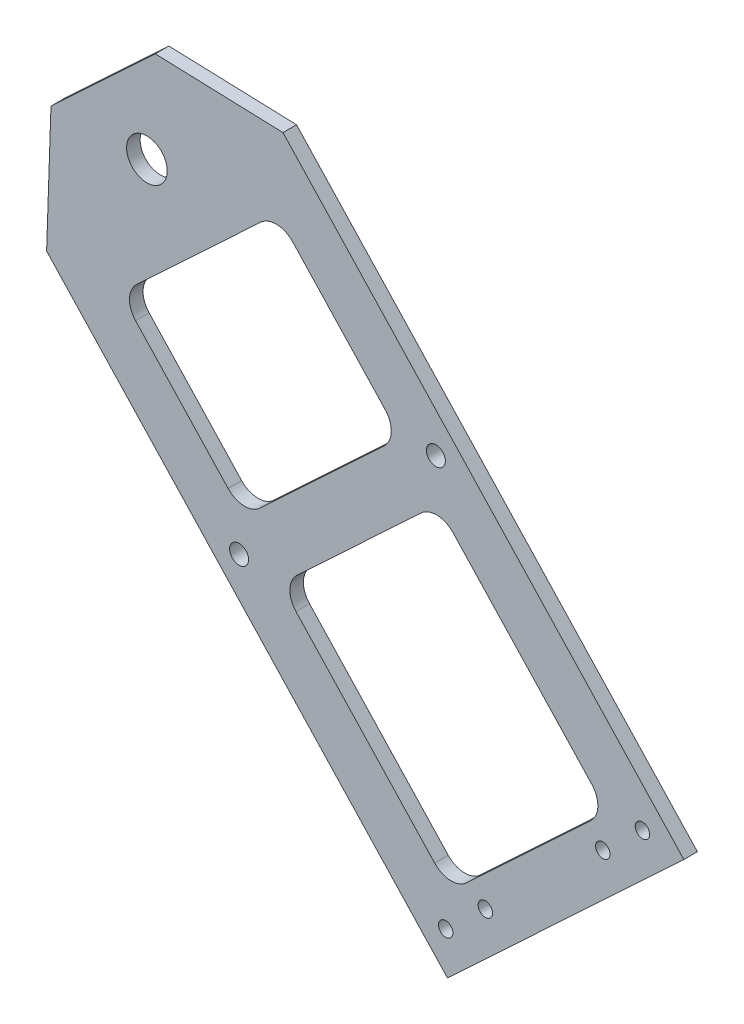
ISO-10303-21;
HEADER;
FILE_DESCRIPTION(('STEP AP214'),'2;1');
FILE_NAME('part.step','',(''),(''),'','','');
FILE_SCHEMA(('AUTOMOTIVE_DESIGN { 1 0 10303 214 1 1 1 1 }'));
ENDSEC;
DATA;
#1=APPLICATION_CONTEXT('core data for automotive mechanical design processes');
#2=APPLICATION_PROTOCOL_DEFINITION('international standard','automotive_design',2000,#1);
#3=PRODUCT_CONTEXT('',#1,'mechanical');
#4=PRODUCT('Part','Part','',(#3));
#5=PRODUCT_RELATED_PRODUCT_CATEGORY('part','',(#4));
#6=PRODUCT_DEFINITION_FORMATION('','',#4);
#7=PRODUCT_DEFINITION_CONTEXT('part definition',#1,'design');
#8=PRODUCT_DEFINITION('design','',#6,#7);
#9=PRODUCT_DEFINITION_SHAPE('','',#8);
#10=(LENGTH_UNIT() NAMED_UNIT(*) SI_UNIT(.MILLI.,.METRE.));
#11=(NAMED_UNIT(*) PLANE_ANGLE_UNIT() SI_UNIT($,.RADIAN.));
#12=(NAMED_UNIT(*) SI_UNIT($,.STERADIAN.) SOLID_ANGLE_UNIT());
#13=UNCERTAINTY_MEASURE_WITH_UNIT(LENGTH_MEASURE(1.E-05),#10,'distance_accuracy_value','');
#14=(GEOMETRIC_REPRESENTATION_CONTEXT(3) GLOBAL_UNCERTAINTY_ASSIGNED_CONTEXT((#13)) GLOBAL_UNIT_ASSIGNED_CONTEXT((#10,
#11,#12)) REPRESENTATION_CONTEXT('',''));
#15=CARTESIAN_POINT('',(0.,0.,0.));
#16=DIRECTION('',(0.,0.,1.));
#17=DIRECTION('',(1.,0.,0.));
#18=AXIS2_PLACEMENT_3D('',#15,#16,#17);
#19=CARTESIAN_POINT('',(0.,0.,3.));
#20=DIRECTION('',(0.,0.,1.));
#21=DIRECTION('',(1.,0.,0.));
#22=AXIS2_PLACEMENT_3D('',#19,#20,#21);
#23=PLANE('',#22);
#24=CARTESIAN_POINT('',(-290.234723661467,-122.373863649196,3.));
#25=DIRECTION('',(0.,0.,1.));
#26=DIRECTION('',(1.,0.,0.));
#27=AXIS2_PLACEMENT_3D('',#24,#25,#26);
#28=CIRCLE('',#27,1.59999999999996);
#29=CARTESIAN_POINT('',(-288.634723661467,-122.373863649196,3.));
#30=VERTEX_POINT('',#29);
#31=EDGE_CURVE('E509',#30,#30,#28,.T.);
#32=ORIENTED_EDGE('',*,*,#31,.F.);
#33=EDGE_LOOP('',(#32));
#34=FACE_BOUND('',#33,.T.);
#35=CARTESIAN_POINT('',(-325.019633878422,-154.866478520862,3.));
#36=DIRECTION('',(0.,0.,1.));
#37=DIRECTION('',(1.,0.,0.));
#38=AXIS2_PLACEMENT_3D('',#35,#36,#37);
#39=CIRCLE('',#38,1.59999999999996);
#40=CARTESIAN_POINT('',(-323.419633878422,-154.866478520862,3.));
#41=VERTEX_POINT('',#40);
#42=EDGE_CURVE('E521',#41,#41,#39,.T.);
#43=ORIENTED_EDGE('',*,*,#42,.F.);
#44=EDGE_LOOP('',(#43));
#45=FACE_BOUND('',#44,.T.);
#46=DIRECTION('',(-0.730775424725951,-0.682617959488765,0.));
#47=VECTOR('',#46,1.);
#48=CARTESIAN_POINT('',(-393.434315669179,-65.5108333971788,3.));
#49=LINE('',#48,#47);
#50=CARTESIAN_POINT('',(-365.957159699483,-39.8443981204011,3.));
#51=VERTEX_POINT('',#50);
#52=CARTESIAN_POINT('',(-393.434315669179,-65.5108333971787,3.));
#53=VERTEX_POINT('',#52);
#54=EDGE_CURVE('E192',#51,#53,#49,.T.);
#55=ORIENTED_EDGE('',*,*,#54,.F.);
#56=CARTESIAN_POINT('',(-362.544069902039,-43.4982752440309,3.));
#57=DIRECTION('',(0.,0.,1.));
#58=DIRECTION('',(1.,0.,0.));
#59=AXIS2_PLACEMENT_3D('',#56,#57,#58);
#60=CIRCLE('',#59,4.99999999999998);
#61=CARTESIAN_POINT('',(-358.890192778409,-40.085185446587,3.));
#62=VERTEX_POINT('',#61);
#63=EDGE_CURVE('E184',#62,#51,#60,.T.);
#64=ORIENTED_EDGE('',*,*,#63,.F.);
#65=DIRECTION('',(-0.682617959488765,0.730775424725951,0.));
#66=VECTOR('',#65,1.);
#67=CARTESIAN_POINT('',(-338.411653993746,-62.0084481883656,3.));
#68=LINE('',#67,#66);
#69=CARTESIAN_POINT('',(-338.411653993746,-62.0084481883656,3.));
#70=VERTEX_POINT('',#69);
#71=EDGE_CURVE('E219',#70,#62,#68,.T.);
#72=ORIENTED_EDGE('',*,*,#71,.F.);
#73=CARTESIAN_POINT('',(-342.065531117376,-65.4215379858094,3.));
#74=DIRECTION('',(0.,0.,1.));
#75=DIRECTION('',(1.,0.,0.));
#76=AXIS2_PLACEMENT_3D('',#73,#74,#75);
#77=CIRCLE('',#76,4.99999999999998);
#78=CARTESIAN_POINT('',(-338.652441319932,-69.0754151094392,3.));
#79=VERTEX_POINT('',#78);
#80=EDGE_CURVE('E217',#79,#70,#77,.T.);
#81=ORIENTED_EDGE('',*,*,#80,.F.);
#82=DIRECTION('',(0.730775424725951,0.682617959488766,0.));
#83=VECTOR('',#82,1.);
#84=CARTESIAN_POINT('',(-366.129597289628,-94.7418503862168,3.));
#85=LINE('',#84,#83);
#86=CARTESIAN_POINT('',(-366.129597289628,-94.7418503862168,3.));
#87=VERTEX_POINT('',#86);
#88=EDGE_CURVE('E215',#87,#79,#85,.T.);
#89=ORIENTED_EDGE('',*,*,#88,.F.);
#90=CARTESIAN_POINT('',(-369.542687087072,-91.0879732625871,3.));
#91=DIRECTION('',(0.,0.,1.));
#92=DIRECTION('',(1.,0.,0.));
#93=AXIS2_PLACEMENT_3D('',#90,#91,#92);
#94=CIRCLE('',#93,5.00000000000001);
#95=CARTESIAN_POINT('',(-373.196564210702,-94.5010630600309,3.));
#96=VERTEX_POINT('',#95);
#97=EDGE_CURVE('E213',#96,#87,#94,.T.);
#98=ORIENTED_EDGE('',*,*,#97,.F.);
#99=DIRECTION('',(0.682617959488766,-0.730775424725951,0.));
#100=VECTOR('',#99,1.);
#101=CARTESIAN_POINT('',(-373.196564210702,-94.5010630600309,3.));
#102=LINE('',#101,#100);
#103=CARTESIAN_POINT('',(-393.675102995365,-72.5778003182523,3.));
#104=VERTEX_POINT('',#103);
#105=EDGE_CURVE('E208',#104,#96,#102,.T.);
#106=ORIENTED_EDGE('',*,*,#105,.F.);
#107=CARTESIAN_POINT('',(-390.021225871735,-69.1647105208085,3.));
#108=DIRECTION('',(0.,0.,1.));
#109=DIRECTION('',(-1.,0.,0.));
#110=AXIS2_PLACEMENT_3D('',#107,#108,#109);
#111=CIRCLE('',#110,5.);
#112=EDGE_CURVE('E206',#53,#104,#111,.T.);
#113=ORIENTED_EDGE('',*,*,#112,.F.);
#114=EDGE_LOOP('',(#55,#64,#72,#81,#89,#98,#106,#113));
#115=FACE_BOUND('',#114,.T.);
#116=CARTESIAN_POINT('',(-370.75503716417,-105.904525064223,3.));
#117=DIRECTION('',(0.,0.,1.));
#118=DIRECTION('',(1.,0.,0.));
#119=AXIS2_PLACEMENT_3D('',#116,#117,#118);
#120=CIRCLE('',#119,2.10000000000005);
#121=CARTESIAN_POINT('',(-368.65503716417,-105.904525064223,3.));
#122=VERTEX_POINT('',#121);
#123=EDGE_CURVE('E252',#122,#122,#120,.T.);
#124=ORIENTED_EDGE('',*,*,#123,.F.);
#125=EDGE_LOOP('',(#124));
#126=FACE_BOUND('',#125,.T.);
#127=DIRECTION('',(-0.682617959488764,0.730775424725952,0.));
#128=VECTOR('',#127,1.);
#129=CARTESIAN_POINT('',(-292.676250707999,-110.970401645004,3.));
#130=LINE('',#129,#128);
#131=CARTESIAN_POINT('',(-292.676250707999,-110.970401645004,3.));
#132=VERTEX_POINT('',#131);
#133=CARTESIAN_POINT('',(-323.394058884994,-78.0855075323366,3.));
#134=VERTEX_POINT('',#133);
#135=EDGE_CURVE('E266',#132,#134,#130,.T.);
#136=ORIENTED_EDGE('',*,*,#135,.F.);
#137=CARTESIAN_POINT('',(-296.330127831629,-114.383491442448,3.));
#138=DIRECTION('',(0.,0.,1.));
#139=DIRECTION('',(1.,0.,0.));
#140=AXIS2_PLACEMENT_3D('',#137,#138,#139);
#141=CIRCLE('',#140,5.00000000000002);
#142=CARTESIAN_POINT('',(-292.917038034185,-118.037368566078,3.));
#143=VERTEX_POINT('',#142);
#144=EDGE_CURVE('E264',#143,#132,#141,.T.);
#145=ORIENTED_EDGE('',*,*,#144,.F.);
#146=DIRECTION('',(0.730775424725952,0.682617959488764,0.));
#147=VECTOR('',#146,1.);
#148=CARTESIAN_POINT('',(-320.394194003881,-143.703803842856,3.));
#149=LINE('',#148,#147);
#150=CARTESIAN_POINT('',(-320.394194003881,-143.703803842856,3.));
#151=VERTEX_POINT('',#150);
#152=EDGE_CURVE('E280',#151,#143,#149,.T.);
#153=ORIENTED_EDGE('',*,*,#152,.F.);
#154=CARTESIAN_POINT('',(-323.807283801325,-140.049926719226,3.));
#155=DIRECTION('',(0.,0.,1.));
#156=DIRECTION('',(1.,0.,0.));
#157=AXIS2_PLACEMENT_3D('',#154,#155,#156);
#158=CIRCLE('',#157,4.99999999999997);
#159=CARTESIAN_POINT('',(-327.461160924954,-143.46301651667,3.));
#160=VERTEX_POINT('',#159);
#161=EDGE_CURVE('E277',#160,#151,#158,.T.);
#162=ORIENTED_EDGE('',*,*,#161,.F.);
#163=DIRECTION('',(0.682617959488765,-0.730775424725951,0.));
#164=VECTOR('',#163,1.);
#165=CARTESIAN_POINT('',(-327.461160924954,-143.46301651667,3.));
#166=LINE('',#165,#164);
#167=CARTESIAN_POINT('',(-358.178969101949,-110.578122404002,3.));
#168=VERTEX_POINT('',#167);
#169=EDGE_CURVE('E275',#168,#160,#166,.T.);
#170=ORIENTED_EDGE('',*,*,#169,.F.);
#171=CARTESIAN_POINT('',(-354.525091978319,-107.165032606558,3.));
#172=DIRECTION('',(0.,0.,1.));
#173=DIRECTION('',(-1.,0.,0.));
#174=AXIS2_PLACEMENT_3D('',#171,#172,#173);
#175=CIRCLE('',#174,4.99999999999999);
#176=CARTESIAN_POINT('',(-357.938181775763,-103.511155482928,3.));
#177=VERTEX_POINT('',#176);
#178=EDGE_CURVE('E273',#177,#168,#175,.T.);
#179=ORIENTED_EDGE('',*,*,#178,.F.);
#180=DIRECTION('',(-0.730775424725951,-0.682617959488766,0.));
#181=VECTOR('',#180,1.);
#182=CARTESIAN_POINT('',(-357.938181775763,-103.511155482928,3.));
#183=LINE('',#182,#181);
#184=CARTESIAN_POINT('',(-330.461025806067,-77.8447202061507,3.));
#185=VERTEX_POINT('',#184);
#186=EDGE_CURVE('E271',#185,#177,#183,.T.);
#187=ORIENTED_EDGE('',*,*,#186,.F.);
#188=CARTESIAN_POINT('',(-327.047936008623,-81.4985973297804,3.));
#189=DIRECTION('',(0.,0.,1.));
#190=DIRECTION('',(1.,0.,0.));
#191=AXIS2_PLACEMENT_3D('',#188,#189,#190);
#192=CIRCLE('',#191,5.00000000000002);
#193=EDGE_CURVE('E269',#134,#185,#192,.T.);
#194=ORIENTED_EDGE('',*,*,#193,.F.);
#195=EDGE_LOOP('',(#136,#145,#153,#162,#170,#179,#187,#194));
#196=FACE_BOUND('',#195,.T.);
#197=DIRECTION('',(-0.0340524702339699,-0.999420046462429,0.));
#198=VECTOR('',#197,1.);
#199=CARTESIAN_POINT('',(-413.366295443896,-69.0768090365023,3.));
#200=LINE('',#199,#198);
#201=CARTESIAN_POINT('',(-412.403146139153,-40.808941352208,3.));
#202=VERTEX_POINT('',#201);
#203=CARTESIAN_POINT('',(-413.366295443896,-69.0768090365023,3.));
#204=VERTEX_POINT('',#203);
#205=EDGE_CURVE('E323',#202,#204,#200,.T.);
#206=ORIENTED_EDGE('',*,*,#205,.T.);
#207=DIRECTION('',(0.682617959488766,-0.730775424725951,0.));
#208=VECTOR('',#207,1.);
#209=CARTESIAN_POINT('',(-324.625960710357,-164.077614250876,3.));
#210=LINE('',#209,#208);
#211=CARTESIAN_POINT('',(-324.625960710357,-164.077614250876,3.));
#212=VERTEX_POINT('',#211);
#213=EDGE_CURVE('E326',#204,#212,#210,.T.);
#214=ORIENTED_EDGE('',*,*,#213,.T.);
#215=DIRECTION('',(0.730775424725951,0.682617959488765,0.));
#216=VECTOR('',#215,1.);
#217=CARTESIAN_POINT('',(-324.625960710357,-164.077614250876,3.));
#218=LINE('',#217,#216);
#219=CARTESIAN_POINT('',(-272.302440299979,-115.20216835148,3.));
#220=VERTEX_POINT('',#219);
#221=EDGE_CURVE('E329',#212,#220,#218,.T.);
#222=ORIENTED_EDGE('',*,*,#221,.T.);
#223=DIRECTION('',(-0.682617959488766,0.730775424725951,0.));
#224=VECTOR('',#223,1.);
#225=CARTESIAN_POINT('',(-272.302440299979,-115.20216835148,3.));
#226=LINE('',#225,#224);
#227=CARTESIAN_POINT('',(-361.042775033518,-20.2013631371067,3.));
#228=VERTEX_POINT('',#227);
#229=EDGE_CURVE('E331',#220,#228,#226,.T.);
#230=ORIENTED_EDGE('',*,*,#229,.T.);
#231=DIRECTION('',(-0.999420046462429,0.0340524702339712,0.));
#232=VECTOR('',#231,1.);
#233=CARTESIAN_POINT('',(-361.042775033518,-20.2013631371067,3.));
#234=LINE('',#233,#232);
#235=CARTESIAN_POINT('',(-389.310642717812,-19.2382138323629,3.));
#236=VERTEX_POINT('',#235);
#237=EDGE_CURVE('E333',#228,#236,#234,.T.);
#238=ORIENTED_EDGE('',*,*,#237,.T.);
#239=DIRECTION('',(-0.730775424725951,-0.682617959488765,0.));
#240=VECTOR('',#239,1.);
#241=CARTESIAN_POINT('',(-412.403146139153,-40.808941352208,3.));
#242=LINE('',#241,#240);
#243=EDGE_CURVE('E335',#236,#202,#242,.T.);
#244=ORIENTED_EDGE('',*,*,#243,.T.);
#245=EDGE_LOOP('',(#206,#214,#222,#230,#238,#244));
#246=FACE_BOUND('',#245,.T.);
#247=CARTESIAN_POINT('',(-327.200821850503,-65.2204946786926,3.));
#248=DIRECTION('',(0.,0.,1.));
#249=DIRECTION('',(1.,0.,0.));
#250=AXIS2_PLACEMENT_3D('',#247,#248,#249);
#251=CIRCLE('',#250,2.09999999999999);
#252=CARTESIAN_POINT('',(-325.100821850503,-65.2204946786926,3.));
#253=VERTEX_POINT('',#252);
#254=EDGE_CURVE('E258',#253,#253,#251,.T.);
#255=ORIENTED_EDGE('',*,*,#254,.F.);
#256=EDGE_LOOP('',(#255));
#257=FACE_BOUND('',#256,.T.);
#258=CARTESIAN_POINT('',(-391.163719403753,-40.4005886233782,3.));
#259=DIRECTION('',(0.,0.,1.));
#260=DIRECTION('',(1.,0.,0.));
#261=AXIS2_PLACEMENT_3D('',#258,#259,#260);
#262=CIRCLE('',#261,4.50000000000002);
#263=CARTESIAN_POINT('',(-386.663719403753,-40.4005886233782,3.));
#264=VERTEX_POINT('',#263);
#265=EDGE_CURVE('E222',#264,#264,#262,.T.);
#266=ORIENTED_EDGE('',*,*,#265,.F.);
#267=EDGE_LOOP('',(#266));
#268=FACE_BOUND('',#267,.T.);
#269=CARTESIAN_POINT('',(-316.250328781711,-146.675063006997,3.));
#270=DIRECTION('',(0.,0.,1.));
#271=DIRECTION('',(1.,0.,0.));
#272=AXIS2_PLACEMENT_3D('',#269,#270,#271);
#273=CIRCLE('',#272,1.59999999999996);
#274=CARTESIAN_POINT('',(-314.650328781711,-146.675063006997,3.));
#275=VERTEX_POINT('',#274);
#276=EDGE_CURVE('E515',#275,#275,#273,.T.);
#277=ORIENTED_EDGE('',*,*,#276,.F.);
#278=EDGE_LOOP('',(#277));
#279=FACE_BOUND('',#278,.T.);
#280=CARTESIAN_POINT('',(-281.465418564756,-114.182448135331,3.));
#281=DIRECTION('',(0.,0.,1.));
#282=DIRECTION('',(1.,0.,0.));
#283=AXIS2_PLACEMENT_3D('',#280,#281,#282);
#284=CIRCLE('',#283,1.59999999999996);
#285=CARTESIAN_POINT('',(-279.865418564756,-114.182448135331,3.));
#286=VERTEX_POINT('',#285);
#287=EDGE_CURVE('E500',#286,#286,#284,.T.);
#288=ORIENTED_EDGE('',*,*,#287,.F.);
#289=EDGE_LOOP('',(#288));
#290=FACE_BOUND('',#289,.T.);
#291=ADVANCED_FACE('F35',(#34,#45,#115,#126,#196,#246,#257,#268,#279,#290),#23,.T.);
#292=CARTESIAN_POINT('',(0.,0.,0.));
#293=DIRECTION('',(0.,0.,1.));
#294=DIRECTION('',(1.,0.,0.));
#295=AXIS2_PLACEMENT_3D('',#292,#293,#294);
#296=PLANE('',#295);
#297=CARTESIAN_POINT('',(-370.75503716417,-105.904525064223,0.));
#298=DIRECTION('',(0.,0.,1.));
#299=DIRECTION('',(1.,0.,0.));
#300=AXIS2_PLACEMENT_3D('',#297,#298,#299);
#301=CIRCLE('',#300,2.10000000000005);
#302=CARTESIAN_POINT('',(-368.65503716417,-105.904525064223,0.));
#303=VERTEX_POINT('',#302);
#304=EDGE_CURVE('E200',#303,#303,#301,.T.);
#305=ORIENTED_EDGE('',*,*,#304,.T.);
#306=EDGE_LOOP('',(#305));
#307=FACE_BOUND('',#306,.T.);
#308=CARTESIAN_POINT('',(-327.200821850503,-65.2204946786926,0.));
#309=DIRECTION('',(0.,0.,1.));
#310=DIRECTION('',(1.,0.,0.));
#311=AXIS2_PLACEMENT_3D('',#308,#309,#310);
#312=CIRCLE('',#311,2.09999999999999);
#313=CARTESIAN_POINT('',(-325.100821850503,-65.2204946786926,0.));
#314=VERTEX_POINT('',#313);
#315=EDGE_CURVE('E255',#314,#314,#312,.T.);
#316=ORIENTED_EDGE('',*,*,#315,.T.);
#317=EDGE_LOOP('',(#316));
#318=FACE_BOUND('',#317,.T.);
#319=CARTESIAN_POINT('',(-296.330127831629,-114.383491442448,0.));
#320=DIRECTION('',(0.,0.,1.));
#321=DIRECTION('',(1.,0.,0.));
#322=AXIS2_PLACEMENT_3D('',#319,#320,#321);
#323=CIRCLE('',#322,5.00000000000002);
#324=CARTESIAN_POINT('',(-292.917038034185,-118.037368566078,0.));
#325=VERTEX_POINT('',#324);
#326=CARTESIAN_POINT('',(-292.676250707999,-110.970401645004,0.));
#327=VERTEX_POINT('',#326);
#328=EDGE_CURVE('E261',#325,#327,#323,.T.);
#329=ORIENTED_EDGE('',*,*,#328,.T.);
#330=DIRECTION('',(-0.682617959488764,0.730775424725952,0.));
#331=VECTOR('',#330,1.);
#332=CARTESIAN_POINT('',(-292.676250707999,-110.970401645004,0.));
#333=LINE('',#332,#331);
#334=CARTESIAN_POINT('',(-323.394058884994,-78.0855075323366,0.));
#335=VERTEX_POINT('',#334);
#336=EDGE_CURVE('E285',#327,#335,#333,.T.);
#337=ORIENTED_EDGE('',*,*,#336,.T.);
#338=CARTESIAN_POINT('',(-327.047936008623,-81.4985973297804,0.));
#339=DIRECTION('',(0.,0.,1.));
#340=DIRECTION('',(1.,0.,0.));
#341=AXIS2_PLACEMENT_3D('',#338,#339,#340);
#342=CIRCLE('',#341,5.00000000000002);
#343=CARTESIAN_POINT('',(-330.461025806067,-77.8447202061507,0.));
#344=VERTEX_POINT('',#343);
#345=EDGE_CURVE('E288',#335,#344,#342,.T.);
#346=ORIENTED_EDGE('',*,*,#345,.T.);
#347=DIRECTION('',(-0.730775424725951,-0.682617959488766,0.));
#348=VECTOR('',#347,1.);
#349=CARTESIAN_POINT('',(-357.938181775763,-103.511155482928,0.));
#350=LINE('',#349,#348);
#351=CARTESIAN_POINT('',(-357.938181775763,-103.511155482928,0.));
#352=VERTEX_POINT('',#351);
#353=EDGE_CURVE('E291',#344,#352,#350,.T.);
#354=ORIENTED_EDGE('',*,*,#353,.T.);
#355=CARTESIAN_POINT('',(-354.525091978319,-107.165032606558,0.));
#356=DIRECTION('',(0.,0.,1.));
#357=DIRECTION('',(-1.,0.,0.));
#358=AXIS2_PLACEMENT_3D('',#355,#356,#357);
#359=CIRCLE('',#358,4.99999999999999);
#360=CARTESIAN_POINT('',(-358.178969101949,-110.578122404002,0.));
#361=VERTEX_POINT('',#360);
#362=EDGE_CURVE('E294',#352,#361,#359,.T.);
#363=ORIENTED_EDGE('',*,*,#362,.T.);
#364=DIRECTION('',(0.682617959488765,-0.730775424725951,0.));
#365=VECTOR('',#364,1.);
#366=CARTESIAN_POINT('',(-327.461160924954,-143.46301651667,0.));
#367=LINE('',#366,#365);
#368=CARTESIAN_POINT('',(-327.461160924954,-143.46301651667,0.));
#369=VERTEX_POINT('',#368);
#370=EDGE_CURVE('E297',#361,#369,#367,.T.);
#371=ORIENTED_EDGE('',*,*,#370,.T.);
#372=CARTESIAN_POINT('',(-323.807283801325,-140.049926719226,0.));
#373=DIRECTION('',(0.,0.,1.));
#374=DIRECTION('',(1.,0.,0.));
#375=AXIS2_PLACEMENT_3D('',#372,#373,#374);
#376=CIRCLE('',#375,4.99999999999997);
#377=CARTESIAN_POINT('',(-320.394194003881,-143.703803842856,0.));
#378=VERTEX_POINT('',#377);
#379=EDGE_CURVE('E300',#369,#378,#376,.T.);
#380=ORIENTED_EDGE('',*,*,#379,.T.);
#381=DIRECTION('',(0.730775424725952,0.682617959488764,0.));
#382=VECTOR('',#381,1.);
#383=CARTESIAN_POINT('',(-320.394194003881,-143.703803842856,0.));
#384=LINE('',#383,#382);
#385=EDGE_CURVE('E267',#378,#325,#384,.T.);
#386=ORIENTED_EDGE('',*,*,#385,.T.);
#387=EDGE_LOOP('',(#329,#337,#346,#354,#363,#371,#380,#386));
#388=FACE_BOUND('',#387,.T.);
#389=DIRECTION('',(-0.0340524702339699,-0.999420046462429,0.));
#390=VECTOR('',#389,1.);
#391=CARTESIAN_POINT('',(-413.366295443896,-69.0768090365023,0.));
#392=LINE('',#391,#390);
#393=CARTESIAN_POINT('',(-412.403146139153,-40.808941352208,0.));
#394=VERTEX_POINT('',#393);
#395=CARTESIAN_POINT('',(-413.366295443896,-69.0768090365023,0.));
#396=VERTEX_POINT('',#395);
#397=EDGE_CURVE('E322',#394,#396,#392,.T.);
#398=ORIENTED_EDGE('',*,*,#397,.F.);
#399=DIRECTION('',(-0.730775424725951,-0.682617959488765,0.));
#400=VECTOR('',#399,1.);
#401=CARTESIAN_POINT('',(-412.403146139153,-40.808941352208,0.));
#402=LINE('',#401,#400);
#403=CARTESIAN_POINT('',(-389.310642717812,-19.2382138323629,0.));
#404=VERTEX_POINT('',#403);
#405=EDGE_CURVE('E327',#404,#394,#402,.T.);
#406=ORIENTED_EDGE('',*,*,#405,.F.);
#407=DIRECTION('',(-0.999420046462429,0.0340524702339712,0.));
#408=VECTOR('',#407,1.);
#409=CARTESIAN_POINT('',(-361.042775033518,-20.2013631371067,0.));
#410=LINE('',#409,#408);
#411=CARTESIAN_POINT('',(-361.042775033518,-20.2013631371067,0.));
#412=VERTEX_POINT('',#411);
#413=EDGE_CURVE('E346',#412,#404,#410,.T.);
#414=ORIENTED_EDGE('',*,*,#413,.F.);
#415=DIRECTION('',(-0.682617959488766,0.730775424725951,0.));
#416=VECTOR('',#415,1.);
#417=CARTESIAN_POINT('',(-272.302440299979,-115.20216835148,0.));
#418=LINE('',#417,#416);
#419=CARTESIAN_POINT('',(-272.302440299979,-115.20216835148,0.));
#420=VERTEX_POINT('',#419);
#421=EDGE_CURVE('E344',#420,#412,#418,.T.);
#422=ORIENTED_EDGE('',*,*,#421,.F.);
#423=DIRECTION('',(0.730775424725951,0.682617959488765,0.));
#424=VECTOR('',#423,1.);
#425=CARTESIAN_POINT('',(-324.625960710357,-164.077614250876,0.));
#426=LINE('',#425,#424);
#427=CARTESIAN_POINT('',(-324.625960710357,-164.077614250876,0.));
#428=VERTEX_POINT('',#427);
#429=EDGE_CURVE('E342',#428,#420,#426,.T.);
#430=ORIENTED_EDGE('',*,*,#429,.F.);
#431=DIRECTION('',(0.682617959488766,-0.730775424725951,0.));
#432=VECTOR('',#431,1.);
#433=CARTESIAN_POINT('',(-324.625960710357,-164.077614250876,0.));
#434=LINE('',#433,#432);
#435=EDGE_CURVE('E340',#396,#428,#434,.T.);
#436=ORIENTED_EDGE('',*,*,#435,.F.);
#437=EDGE_LOOP('',(#398,#406,#414,#422,#430,#436));
#438=FACE_BOUND('',#437,.T.);
#439=CARTESIAN_POINT('',(-362.544069902039,-43.4982752440309,0.));
#440=DIRECTION('',(0.,0.,1.));
#441=DIRECTION('',(1.,0.,0.));
#442=AXIS2_PLACEMENT_3D('',#439,#440,#441);
#443=CIRCLE('',#442,4.99999999999998);
#444=CARTESIAN_POINT('',(-358.890192778409,-40.085185446587,0.));
#445=VERTEX_POINT('',#444);
#446=CARTESIAN_POINT('',(-365.957159699483,-39.8443981204011,0.));
#447=VERTEX_POINT('',#446);
#448=EDGE_CURVE('E58',#445,#447,#443,.T.);
#449=ORIENTED_EDGE('',*,*,#448,.T.);
#450=DIRECTION('',(-0.730775424725951,-0.682617959488765,0.));
#451=VECTOR('',#450,1.);
#452=CARTESIAN_POINT('',(-393.434315669179,-65.5108333971788,0.));
#453=LINE('',#452,#451);
#454=CARTESIAN_POINT('',(-393.434315669179,-65.5108333971787,0.));
#455=VERTEX_POINT('',#454);
#456=EDGE_CURVE('E199',#447,#455,#453,.T.);
#457=ORIENTED_EDGE('',*,*,#456,.T.);
#458=CARTESIAN_POINT('',(-390.021225871735,-69.1647105208085,0.));
#459=DIRECTION('',(0.,0.,1.));
#460=DIRECTION('',(-1.,0.,0.));
#461=AXIS2_PLACEMENT_3D('',#458,#459,#460);
#462=CIRCLE('',#461,5.);
#463=CARTESIAN_POINT('',(-393.675102995365,-72.5778003182523,0.));
#464=VERTEX_POINT('',#463);
#465=EDGE_CURVE('E224',#455,#464,#462,.T.);
#466=ORIENTED_EDGE('',*,*,#465,.T.);
#467=DIRECTION('',(0.682617959488766,-0.730775424725951,0.));
#468=VECTOR('',#467,1.);
#469=CARTESIAN_POINT('',(-373.196564210702,-94.5010630600309,0.));
#470=LINE('',#469,#468);
#471=CARTESIAN_POINT('',(-373.196564210702,-94.5010630600309,0.));
#472=VERTEX_POINT('',#471);
#473=EDGE_CURVE('E227',#464,#472,#470,.T.);
#474=ORIENTED_EDGE('',*,*,#473,.T.);
#475=CARTESIAN_POINT('',(-369.542687087072,-91.0879732625871,0.));
#476=DIRECTION('',(0.,0.,1.));
#477=DIRECTION('',(1.,0.,0.));
#478=AXIS2_PLACEMENT_3D('',#475,#476,#477);
#479=CIRCLE('',#478,5.00000000000001);
#480=CARTESIAN_POINT('',(-366.129597289628,-94.7418503862168,0.));
#481=VERTEX_POINT('',#480);
#482=EDGE_CURVE('E230',#472,#481,#479,.T.);
#483=ORIENTED_EDGE('',*,*,#482,.T.);
#484=DIRECTION('',(0.730775424725951,0.682617959488766,0.));
#485=VECTOR('',#484,1.);
#486=CARTESIAN_POINT('',(-366.129597289628,-94.7418503862168,0.));
#487=LINE('',#486,#485);
#488=CARTESIAN_POINT('',(-338.652441319932,-69.0754151094392,0.));
#489=VERTEX_POINT('',#488);
#490=EDGE_CURVE('E233',#481,#489,#487,.T.);
#491=ORIENTED_EDGE('',*,*,#490,.T.);
#492=CARTESIAN_POINT('',(-342.065531117376,-65.4215379858094,0.));
#493=DIRECTION('',(0.,0.,1.));
#494=DIRECTION('',(1.,0.,0.));
#495=AXIS2_PLACEMENT_3D('',#492,#493,#494);
#496=CIRCLE('',#495,4.99999999999998);
#497=CARTESIAN_POINT('',(-338.411653993746,-62.0084481883656,0.));
#498=VERTEX_POINT('',#497);
#499=EDGE_CURVE('E236',#489,#498,#496,.T.);
#500=ORIENTED_EDGE('',*,*,#499,.T.);
#501=DIRECTION('',(-0.682617959488765,0.730775424725951,0.));
#502=VECTOR('',#501,1.);
#503=CARTESIAN_POINT('',(-338.411653993746,-62.0084481883656,0.));
#504=LINE('',#503,#502);
#505=EDGE_CURVE('E193',#498,#445,#504,.T.);
#506=ORIENTED_EDGE('',*,*,#505,.T.);
#507=EDGE_LOOP('',(#449,#457,#466,#474,#483,#491,#500,#506));
#508=FACE_BOUND('',#507,.T.);
#509=CARTESIAN_POINT('',(-391.163719403753,-40.4005886233782,0.));
#510=DIRECTION('',(0.,0.,1.));
#511=DIRECTION('',(1.,0.,0.));
#512=AXIS2_PLACEMENT_3D('',#509,#510,#511);
#513=CIRCLE('',#512,4.50000000000002);
#514=CARTESIAN_POINT('',(-386.663719403753,-40.4005886233782,0.));
#515=VERTEX_POINT('',#514);
#516=EDGE_CURVE('E524',#515,#515,#513,.T.);
#517=ORIENTED_EDGE('',*,*,#516,.T.);
#518=EDGE_LOOP('',(#517));
#519=FACE_BOUND('',#518,.T.);
#520=CARTESIAN_POINT('',(-325.019633878422,-154.866478520862,0.));
#521=DIRECTION('',(0.,0.,1.));
#522=DIRECTION('',(1.,0.,0.));
#523=AXIS2_PLACEMENT_3D('',#520,#521,#522);
#524=CIRCLE('',#523,1.59999999999996);
#525=CARTESIAN_POINT('',(-323.419633878422,-154.866478520862,0.));
#526=VERTEX_POINT('',#525);
#527=EDGE_CURVE('E518',#526,#526,#524,.T.);
#528=ORIENTED_EDGE('',*,*,#527,.T.);
#529=EDGE_LOOP('',(#528));
#530=FACE_BOUND('',#529,.T.);
#531=CARTESIAN_POINT('',(-316.250328781711,-146.675063006997,0.));
#532=DIRECTION('',(0.,0.,1.));
#533=DIRECTION('',(1.,0.,0.));
#534=AXIS2_PLACEMENT_3D('',#531,#532,#533);
#535=CIRCLE('',#534,1.59999999999996);
#536=CARTESIAN_POINT('',(-314.650328781711,-146.675063006997,0.));
#537=VERTEX_POINT('',#536);
#538=EDGE_CURVE('E512',#537,#537,#535,.T.);
#539=ORIENTED_EDGE('',*,*,#538,.T.);
#540=EDGE_LOOP('',(#539));
#541=FACE_BOUND('',#540,.T.);
#542=CARTESIAN_POINT('',(-290.234723661467,-122.373863649196,0.));
#543=DIRECTION('',(0.,0.,1.));
#544=DIRECTION('',(1.,0.,0.));
#545=AXIS2_PLACEMENT_3D('',#542,#543,#544);
#546=CIRCLE('',#545,1.59999999999996);
#547=CARTESIAN_POINT('',(-288.634723661467,-122.373863649196,0.));
#548=VERTEX_POINT('',#547);
#549=EDGE_CURVE('E506',#548,#548,#546,.T.);
#550=ORIENTED_EDGE('',*,*,#549,.T.);
#551=EDGE_LOOP('',(#550));
#552=FACE_BOUND('',#551,.T.);
#553=CARTESIAN_POINT('',(-281.465418564756,-114.182448135331,0.));
#554=DIRECTION('',(0.,0.,1.));
#555=DIRECTION('',(1.,0.,0.));
#556=AXIS2_PLACEMENT_3D('',#553,#554,#555);
#557=CIRCLE('',#556,1.59999999999996);
#558=CARTESIAN_POINT('',(-279.865418564756,-114.182448135331,0.));
#559=VERTEX_POINT('',#558);
#560=EDGE_CURVE('E503',#559,#559,#557,.T.);
#561=ORIENTED_EDGE('',*,*,#560,.T.);
#562=EDGE_LOOP('',(#561));
#563=FACE_BOUND('',#562,.T.);
#564=ADVANCED_FACE('F370',(#307,#318,#388,#438,#508,#519,#530,#541,#552,#563),#296,.F.);
#565=CARTESIAN_POINT('',(-413.366295443896,-69.0768090365023,3.));
#566=DIRECTION('',(0.999420046462429,-0.0340524702339699,0.));
#567=DIRECTION('',(0.0340524702339699,0.99942004646243,0.));
#568=AXIS2_PLACEMENT_3D('',#565,#566,#567);
#569=PLANE('',#568);
#570=ORIENTED_EDGE('',*,*,#397,.T.);
#571=DIRECTION('',(0.,0.,-1.));
#572=VECTOR('',#571,1.);
#573=CARTESIAN_POINT('',(-413.366295443896,-69.0768090365023,3.));
#574=LINE('',#573,#572);
#575=EDGE_CURVE('E11',#204,#396,#574,.T.);
#576=ORIENTED_EDGE('',*,*,#575,.F.);
#577=ORIENTED_EDGE('',*,*,#205,.F.);
#578=DIRECTION('',(0.,0.,-1.));
#579=VECTOR('',#578,1.);
#580=CARTESIAN_POINT('',(-412.403146139153,-40.808941352208,3.));
#581=LINE('',#580,#579);
#582=EDGE_CURVE('E337',#202,#394,#581,.T.);
#583=ORIENTED_EDGE('',*,*,#582,.T.);
#584=EDGE_LOOP('',(#570,#576,#577,#583));
#585=FACE_BOUND('',#584,.T.);
#586=ADVANCED_FACE('F37',(#585),#569,.F.);
#587=CARTESIAN_POINT('',(-324.625960710357,-164.077614250876,3.));
#588=DIRECTION('',(0.730775424725951,0.682617959488766,0.));
#589=DIRECTION('',(-0.682617959488766,0.730775424725951,0.));
#590=AXIS2_PLACEMENT_3D('',#587,#588,#589);
#591=PLANE('',#590);
#592=ORIENTED_EDGE('',*,*,#435,.T.);
#593=DIRECTION('',(0.,0.,-1.));
#594=VECTOR('',#593,1.);
#595=CARTESIAN_POINT('',(-324.625960710357,-164.077614250876,3.));
#596=LINE('',#595,#594);
#597=EDGE_CURVE('E43',#212,#428,#596,.T.);
#598=ORIENTED_EDGE('',*,*,#597,.F.);
#599=ORIENTED_EDGE('',*,*,#213,.F.);
#600=ORIENTED_EDGE('',*,*,#575,.T.);
#601=EDGE_LOOP('',(#592,#598,#599,#600));
#602=FACE_BOUND('',#601,.T.);
#603=ADVANCED_FACE('F388',(#602),#591,.F.);
#604=CARTESIAN_POINT('',(-324.625960710357,-164.077614250876,3.));
#605=DIRECTION('',(-0.682617959488765,0.730775424725951,0.));
#606=DIRECTION('',(-0.730775424725951,-0.682617959488765,0.));
#607=AXIS2_PLACEMENT_3D('',#604,#605,#606);
#608=PLANE('',#607);
#609=ORIENTED_EDGE('',*,*,#429,.T.);
#610=DIRECTION('',(0.,0.,-1.));
#611=VECTOR('',#610,1.);
#612=CARTESIAN_POINT('',(-272.302440299979,-115.20216835148,3.));
#613=LINE('',#612,#611);
#614=EDGE_CURVE('E357',#220,#420,#613,.T.);
#615=ORIENTED_EDGE('',*,*,#614,.F.);
#616=ORIENTED_EDGE('',*,*,#221,.F.);
#617=ORIENTED_EDGE('',*,*,#597,.T.);
#618=EDGE_LOOP('',(#609,#615,#616,#617));
#619=FACE_BOUND('',#618,.T.);
#620=ADVANCED_FACE('F364',(#619),#608,.F.);
#621=CARTESIAN_POINT('',(-272.302440299979,-115.20216835148,3.));
#622=DIRECTION('',(-0.730775424725951,-0.682617959488765,0.));
#623=DIRECTION('',(0.682617959488766,-0.730775424725951,0.));
#624=AXIS2_PLACEMENT_3D('',#621,#622,#623);
#625=PLANE('',#624);
#626=ORIENTED_EDGE('',*,*,#421,.T.);
#627=DIRECTION('',(0.,0.,-1.));
#628=VECTOR('',#627,1.);
#629=CARTESIAN_POINT('',(-361.042775033518,-20.2013631371067,3.));
#630=LINE('',#629,#628);
#631=EDGE_CURVE('E354',#228,#412,#630,.T.);
#632=ORIENTED_EDGE('',*,*,#631,.F.);
#633=ORIENTED_EDGE('',*,*,#229,.F.);
#634=ORIENTED_EDGE('',*,*,#614,.T.);
#635=EDGE_LOOP('',(#626,#632,#633,#634));
#636=FACE_BOUND('',#635,.T.);
#637=ADVANCED_FACE('F376',(#636),#625,.F.);
#638=CARTESIAN_POINT('',(-361.042775033518,-20.2013631371067,3.));
#639=DIRECTION('',(-0.0340524702339712,-0.999420046462429,0.));
#640=DIRECTION('',(0.99942004646243,-0.0340524702339712,0.));
#641=AXIS2_PLACEMENT_3D('',#638,#639,#640);
#642=PLANE('',#641);
#643=ORIENTED_EDGE('',*,*,#413,.T.);
#644=DIRECTION('',(0.,0.,-1.));
#645=VECTOR('',#644,1.);
#646=CARTESIAN_POINT('',(-389.310642717812,-19.2382138323629,3.));
#647=LINE('',#646,#645);
#648=EDGE_CURVE('E351',#236,#404,#647,.T.);
#649=ORIENTED_EDGE('',*,*,#648,.F.);
#650=ORIENTED_EDGE('',*,*,#237,.F.);
#651=ORIENTED_EDGE('',*,*,#631,.T.);
#652=EDGE_LOOP('',(#643,#649,#650,#651));
#653=FACE_BOUND('',#652,.T.);
#654=ADVANCED_FACE('F380',(#653),#642,.F.);
#655=CARTESIAN_POINT('',(-412.403146139153,-40.808941352208,3.));
#656=DIRECTION('',(0.682617959488765,-0.730775424725951,0.));
#657=DIRECTION('',(0.730775424725951,0.682617959488765,0.));
#658=AXIS2_PLACEMENT_3D('',#655,#656,#657);
#659=PLANE('',#658);
#660=ORIENTED_EDGE('',*,*,#405,.T.);
#661=ORIENTED_EDGE('',*,*,#582,.F.);
#662=ORIENTED_EDGE('',*,*,#243,.F.);
#663=ORIENTED_EDGE('',*,*,#648,.T.);
#664=EDGE_LOOP('',(#660,#661,#662,#663));
#665=FACE_BOUND('',#664,.T.);
#666=ADVANCED_FACE('F391',(#665),#659,.F.);
#667=CARTESIAN_POINT('',(-296.330127831629,-114.383491442448,3.));
#668=DIRECTION('',(0.,0.,-1.));
#669=DIRECTION('',(-1.,0.,0.));
#670=AXIS2_PLACEMENT_3D('',#667,#668,#669);
#671=CYLINDRICAL_SURFACE('',#670,5.00000000000002);
#672=ORIENTED_EDGE('',*,*,#328,.F.);
#673=DIRECTION('',(0.,0.,-1.));
#674=VECTOR('',#673,1.);
#675=CARTESIAN_POINT('',(-292.917038034185,-118.037368566078,3.));
#676=LINE('',#675,#674);
#677=EDGE_CURVE('E282',#143,#325,#676,.T.);
#678=ORIENTED_EDGE('',*,*,#677,.F.);
#679=ORIENTED_EDGE('',*,*,#144,.T.);
#680=DIRECTION('',(0.,0.,-1.));
#681=VECTOR('',#680,1.);
#682=CARTESIAN_POINT('',(-292.676250707999,-110.970401645004,3.));
#683=LINE('',#682,#681);
#684=EDGE_CURVE('E319',#132,#327,#683,.T.);
#685=ORIENTED_EDGE('',*,*,#684,.T.);
#686=EDGE_LOOP('',(#672,#678,#679,#685));
#687=FACE_BOUND('',#686,.T.);
#688=ADVANCED_FACE('F393',(#687),#671,.F.);
#689=CARTESIAN_POINT('',(-292.676250707999,-110.970401645004,3.));
#690=DIRECTION('',(-0.730775424725952,-0.682617959488764,0.));
#691=DIRECTION('',(0.682617959488764,-0.730775424725952,0.));
#692=AXIS2_PLACEMENT_3D('',#689,#690,#691);
#693=PLANE('',#692);
#694=ORIENTED_EDGE('',*,*,#336,.F.);
#695=ORIENTED_EDGE('',*,*,#684,.F.);
#696=ORIENTED_EDGE('',*,*,#135,.T.);
#697=DIRECTION('',(0.,0.,-1.));
#698=VECTOR('',#697,1.);
#699=CARTESIAN_POINT('',(-323.394058884994,-78.0855075323366,3.));
#700=LINE('',#699,#698);
#701=EDGE_CURVE('E317',#134,#335,#700,.T.);
#702=ORIENTED_EDGE('',*,*,#701,.T.);
#703=EDGE_LOOP('',(#694,#695,#696,#702));
#704=FACE_BOUND('',#703,.T.);
#705=ADVANCED_FACE('F399',(#704),#693,.T.);
#706=CARTESIAN_POINT('',(-327.047936008623,-81.4985973297804,3.));
#707=DIRECTION('',(0.,0.,-1.));
#708=DIRECTION('',(-1.,0.,0.));
#709=AXIS2_PLACEMENT_3D('',#706,#707,#708);
#710=CYLINDRICAL_SURFACE('',#709,5.00000000000002);
#711=ORIENTED_EDGE('',*,*,#345,.F.);
#712=ORIENTED_EDGE('',*,*,#701,.F.);
#713=ORIENTED_EDGE('',*,*,#193,.T.);
#714=DIRECTION('',(0.,0.,-1.));
#715=VECTOR('',#714,1.);
#716=CARTESIAN_POINT('',(-330.461025806067,-77.8447202061507,3.));
#717=LINE('',#716,#715);
#718=EDGE_CURVE('E315',#185,#344,#717,.T.);
#719=ORIENTED_EDGE('',*,*,#718,.T.);
#720=EDGE_LOOP('',(#711,#712,#713,#719));
#721=FACE_BOUND('',#720,.T.);
#722=ADVANCED_FACE('F416',(#721),#710,.F.);
#723=CARTESIAN_POINT('',(-357.938181775763,-103.511155482928,3.));
#724=DIRECTION('',(0.682617959488766,-0.730775424725951,0.));
#725=DIRECTION('',(0.730775424725951,0.682617959488766,0.));
#726=AXIS2_PLACEMENT_3D('',#723,#724,#725);
#727=PLANE('',#726);
#728=ORIENTED_EDGE('',*,*,#353,.F.);
#729=ORIENTED_EDGE('',*,*,#718,.F.);
#730=ORIENTED_EDGE('',*,*,#186,.T.);
#731=DIRECTION('',(0.,0.,-1.));
#732=VECTOR('',#731,1.);
#733=CARTESIAN_POINT('',(-357.938181775763,-103.511155482928,3.));
#734=LINE('',#733,#732);
#735=EDGE_CURVE('E313',#177,#352,#734,.T.);
#736=ORIENTED_EDGE('',*,*,#735,.T.);
#737=EDGE_LOOP('',(#728,#729,#730,#736));
#738=FACE_BOUND('',#737,.T.);
#739=ADVANCED_FACE('F420',(#738),#727,.T.);
#740=CARTESIAN_POINT('',(-354.525091978319,-107.165032606558,3.));
#741=DIRECTION('',(0.,0.,-1.));
#742=DIRECTION('',(-1.,0.,0.));
#743=AXIS2_PLACEMENT_3D('',#740,#741,#742);
#744=CYLINDRICAL_SURFACE('',#743,4.99999999999999);
#745=ORIENTED_EDGE('',*,*,#362,.F.);
#746=ORIENTED_EDGE('',*,*,#735,.F.);
#747=ORIENTED_EDGE('',*,*,#178,.T.);
#748=DIRECTION('',(0.,0.,-1.));
#749=VECTOR('',#748,1.);
#750=CARTESIAN_POINT('',(-358.178969101949,-110.578122404002,3.));
#751=LINE('',#750,#749);
#752=EDGE_CURVE('E311',#168,#361,#751,.T.);
#753=ORIENTED_EDGE('',*,*,#752,.T.);
#754=EDGE_LOOP('',(#745,#746,#747,#753));
#755=FACE_BOUND('',#754,.T.);
#756=ADVANCED_FACE('F424',(#755),#744,.F.);
#757=CARTESIAN_POINT('',(-327.461160924954,-143.46301651667,3.));
#758=DIRECTION('',(0.730775424725951,0.682617959488765,0.));
#759=DIRECTION('',(-0.682617959488765,0.730775424725951,0.));
#760=AXIS2_PLACEMENT_3D('',#757,#758,#759);
#761=PLANE('',#760);
#762=ORIENTED_EDGE('',*,*,#370,.F.);
#763=ORIENTED_EDGE('',*,*,#752,.F.);
#764=ORIENTED_EDGE('',*,*,#169,.T.);
#765=DIRECTION('',(0.,0.,-1.));
#766=VECTOR('',#765,1.);
#767=CARTESIAN_POINT('',(-327.461160924954,-143.46301651667,3.));
#768=LINE('',#767,#766);
#769=EDGE_CURVE('E309',#160,#369,#768,.T.);
#770=ORIENTED_EDGE('',*,*,#769,.T.);
#771=EDGE_LOOP('',(#762,#763,#764,#770));
#772=FACE_BOUND('',#771,.T.);
#773=ADVANCED_FACE('F428',(#772),#761,.T.);
#774=CARTESIAN_POINT('',(-323.807283801325,-140.049926719226,3.));
#775=DIRECTION('',(0.,0.,-1.));
#776=DIRECTION('',(-1.,0.,0.));
#777=AXIS2_PLACEMENT_3D('',#774,#775,#776);
#778=CYLINDRICAL_SURFACE('',#777,4.99999999999997);
#779=ORIENTED_EDGE('',*,*,#379,.F.);
#780=ORIENTED_EDGE('',*,*,#769,.F.);
#781=ORIENTED_EDGE('',*,*,#161,.T.);
#782=DIRECTION('',(0.,0.,-1.));
#783=VECTOR('',#782,1.);
#784=CARTESIAN_POINT('',(-320.394194003881,-143.703803842856,3.));
#785=LINE('',#784,#783);
#786=EDGE_CURVE('E307',#151,#378,#785,.T.);
#787=ORIENTED_EDGE('',*,*,#786,.T.);
#788=EDGE_LOOP('',(#779,#780,#781,#787));
#789=FACE_BOUND('',#788,.T.);
#790=ADVANCED_FACE('F432',(#789),#778,.F.);
#791=CARTESIAN_POINT('',(-320.394194003881,-143.703803842856,3.));
#792=DIRECTION('',(-0.682617959488764,0.730775424725952,0.));
#793=DIRECTION('',(-0.730775424725952,-0.682617959488764,0.));
#794=AXIS2_PLACEMENT_3D('',#791,#792,#793);
#795=PLANE('',#794);
#796=ORIENTED_EDGE('',*,*,#385,.F.);
#797=ORIENTED_EDGE('',*,*,#786,.F.);
#798=ORIENTED_EDGE('',*,*,#152,.T.);
#799=ORIENTED_EDGE('',*,*,#677,.T.);
#800=EDGE_LOOP('',(#796,#797,#798,#799));
#801=FACE_BOUND('',#800,.T.);
#802=ADVANCED_FACE('F436',(#801),#795,.T.);
#803=CARTESIAN_POINT('',(-327.200821850503,-65.2204946786926,3.));
#804=DIRECTION('',(0.,0.,-1.));
#805=DIRECTION('',(-1.,0.,0.));
#806=AXIS2_PLACEMENT_3D('',#803,#804,#805);
#807=CYLINDRICAL_SURFACE('',#806,2.09999999999999);
#808=ORIENTED_EDGE('',*,*,#254,.T.);
#809=EDGE_LOOP('',(#808));
#810=FACE_BOUND('',#809,.T.);
#811=ORIENTED_EDGE('',*,*,#315,.F.);
#812=EDGE_LOOP('',(#811));
#813=FACE_BOUND('',#812,.T.);
#814=ADVANCED_FACE('F440',(#810,#813),#807,.F.);
#815=CARTESIAN_POINT('',(-370.75503716417,-105.904525064223,3.));
#816=DIRECTION('',(0.,0.,-1.));
#817=DIRECTION('',(-1.,0.,0.));
#818=AXIS2_PLACEMENT_3D('',#815,#816,#817);
#819=CYLINDRICAL_SURFACE('',#818,2.10000000000005);
#820=ORIENTED_EDGE('',*,*,#123,.T.);
#821=EDGE_LOOP('',(#820));
#822=FACE_BOUND('',#821,.T.);
#823=ORIENTED_EDGE('',*,*,#304,.F.);
#824=EDGE_LOOP('',(#823));
#825=FACE_BOUND('',#824,.T.);
#826=ADVANCED_FACE('F444',(#822,#825),#819,.F.);
#827=CARTESIAN_POINT('',(-362.544069902039,-43.4982752440309,3.));
#828=DIRECTION('',(0.,0.,-1.));
#829=DIRECTION('',(-1.,0.,0.));
#830=AXIS2_PLACEMENT_3D('',#827,#828,#829);
#831=CYLINDRICAL_SURFACE('',#830,4.99999999999998);
#832=ORIENTED_EDGE('',*,*,#448,.F.);
#833=DIRECTION('',(0.,0.,-1.));
#834=VECTOR('',#833,1.);
#835=CARTESIAN_POINT('',(-358.890192778409,-40.085185446587,3.));
#836=LINE('',#835,#834);
#837=EDGE_CURVE('E188',#62,#445,#836,.T.);
#838=ORIENTED_EDGE('',*,*,#837,.F.);
#839=ORIENTED_EDGE('',*,*,#63,.T.);
#840=DIRECTION('',(0.,0.,-1.));
#841=VECTOR('',#840,1.);
#842=CARTESIAN_POINT('',(-365.957159699483,-39.8443981204011,3.));
#843=LINE('',#842,#841);
#844=EDGE_CURVE('E187',#51,#447,#843,.T.);
#845=ORIENTED_EDGE('',*,*,#844,.T.);
#846=EDGE_LOOP('',(#832,#838,#839,#845));
#847=FACE_BOUND('',#846,.T.);
#848=ADVANCED_FACE('F186',(#847),#831,.F.);
#849=CARTESIAN_POINT('',(-393.434315669179,-65.5108333971788,3.));
#850=DIRECTION('',(0.682617959488765,-0.730775424725951,0.));
#851=DIRECTION('',(0.730775424725951,0.682617959488765,0.));
#852=AXIS2_PLACEMENT_3D('',#849,#850,#851);
#853=PLANE('',#852);
#854=ORIENTED_EDGE('',*,*,#456,.F.);
#855=ORIENTED_EDGE('',*,*,#844,.F.);
#856=ORIENTED_EDGE('',*,*,#54,.T.);
#857=DIRECTION('',(0.,0.,-1.));
#858=VECTOR('',#857,1.);
#859=CARTESIAN_POINT('',(-393.434315669179,-65.5108333971787,3.));
#860=LINE('',#859,#858);
#861=EDGE_CURVE('E201',#53,#455,#860,.T.);
#862=ORIENTED_EDGE('',*,*,#861,.T.);
#863=EDGE_LOOP('',(#854,#855,#856,#862));
#864=FACE_BOUND('',#863,.T.);
#865=ADVANCED_FACE('F196',(#864),#853,.T.);
#866=CARTESIAN_POINT('',(-390.021225871735,-69.1647105208085,3.));
#867=DIRECTION('',(0.,0.,-1.));
#868=DIRECTION('',(-1.,0.,0.));
#869=AXIS2_PLACEMENT_3D('',#866,#867,#868);
#870=CYLINDRICAL_SURFACE('',#869,5.);
#871=ORIENTED_EDGE('',*,*,#465,.F.);
#872=ORIENTED_EDGE('',*,*,#861,.F.);
#873=ORIENTED_EDGE('',*,*,#112,.T.);
#874=DIRECTION('',(0.,0.,-1.));
#875=VECTOR('',#874,1.);
#876=CARTESIAN_POINT('',(-393.675102995365,-72.5778003182523,3.));
#877=LINE('',#876,#875);
#878=EDGE_CURVE('E249',#104,#464,#877,.T.);
#879=ORIENTED_EDGE('',*,*,#878,.T.);
#880=EDGE_LOOP('',(#871,#872,#873,#879));
#881=FACE_BOUND('',#880,.T.);
#882=ADVANCED_FACE('F453',(#881),#870,.F.);
#883=CARTESIAN_POINT('',(-373.196564210702,-94.5010630600309,3.));
#884=DIRECTION('',(0.730775424725951,0.682617959488766,0.));
#885=DIRECTION('',(-0.682617959488766,0.730775424725951,0.));
#886=AXIS2_PLACEMENT_3D('',#883,#884,#885);
#887=PLANE('',#886);
#888=ORIENTED_EDGE('',*,*,#473,.F.);
#889=ORIENTED_EDGE('',*,*,#878,.F.);
#890=ORIENTED_EDGE('',*,*,#105,.T.);
#891=DIRECTION('',(0.,0.,-1.));
#892=VECTOR('',#891,1.);
#893=CARTESIAN_POINT('',(-373.196564210702,-94.5010630600309,3.));
#894=LINE('',#893,#892);
#895=EDGE_CURVE('E247',#96,#472,#894,.T.);
#896=ORIENTED_EDGE('',*,*,#895,.T.);
#897=EDGE_LOOP('',(#888,#889,#890,#896));
#898=FACE_BOUND('',#897,.T.);
#899=ADVANCED_FACE('F456',(#898),#887,.T.);
#900=CARTESIAN_POINT('',(-369.542687087072,-91.0879732625871,3.));
#901=DIRECTION('',(0.,0.,-1.));
#902=DIRECTION('',(-1.,0.,0.));
#903=AXIS2_PLACEMENT_3D('',#900,#901,#902);
#904=CYLINDRICAL_SURFACE('',#903,5.00000000000001);
#905=ORIENTED_EDGE('',*,*,#482,.F.);
#906=ORIENTED_EDGE('',*,*,#895,.F.);
#907=ORIENTED_EDGE('',*,*,#97,.T.);
#908=DIRECTION('',(0.,0.,-1.));
#909=VECTOR('',#908,1.);
#910=CARTESIAN_POINT('',(-366.129597289628,-94.7418503862168,3.));
#911=LINE('',#910,#909);
#912=EDGE_CURVE('E245',#87,#481,#911,.T.);
#913=ORIENTED_EDGE('',*,*,#912,.T.);
#914=EDGE_LOOP('',(#905,#906,#907,#913));
#915=FACE_BOUND('',#914,.T.);
#916=ADVANCED_FACE('F460',(#915),#904,.F.);
#917=CARTESIAN_POINT('',(-366.129597289628,-94.7418503862168,3.));
#918=DIRECTION('',(-0.682617959488766,0.730775424725951,0.));
#919=DIRECTION('',(-0.730775424725951,-0.682617959488766,0.));
#920=AXIS2_PLACEMENT_3D('',#917,#918,#919);
#921=PLANE('',#920);
#922=ORIENTED_EDGE('',*,*,#490,.F.);
#923=ORIENTED_EDGE('',*,*,#912,.F.);
#924=ORIENTED_EDGE('',*,*,#88,.T.);
#925=DIRECTION('',(0.,0.,-1.));
#926=VECTOR('',#925,1.);
#927=CARTESIAN_POINT('',(-338.652441319932,-69.0754151094392,3.));
#928=LINE('',#927,#926);
#929=EDGE_CURVE('E243',#79,#489,#928,.T.);
#930=ORIENTED_EDGE('',*,*,#929,.T.);
#931=EDGE_LOOP('',(#922,#923,#924,#930));
#932=FACE_BOUND('',#931,.T.);
#933=ADVANCED_FACE('F464',(#932),#921,.T.);
#934=CARTESIAN_POINT('',(-342.065531117376,-65.4215379858094,3.));
#935=DIRECTION('',(0.,0.,-1.));
#936=DIRECTION('',(-1.,0.,0.));
#937=AXIS2_PLACEMENT_3D('',#934,#935,#936);
#938=CYLINDRICAL_SURFACE('',#937,4.99999999999998);
#939=ORIENTED_EDGE('',*,*,#499,.F.);
#940=ORIENTED_EDGE('',*,*,#929,.F.);
#941=ORIENTED_EDGE('',*,*,#80,.T.);
#942=DIRECTION('',(0.,0.,-1.));
#943=VECTOR('',#942,1.);
#944=CARTESIAN_POINT('',(-338.411653993746,-62.0084481883656,3.));
#945=LINE('',#944,#943);
#946=EDGE_CURVE('E50',#70,#498,#945,.T.);
#947=ORIENTED_EDGE('',*,*,#946,.T.);
#948=EDGE_LOOP('',(#939,#940,#941,#947));
#949=FACE_BOUND('',#948,.T.);
#950=ADVANCED_FACE('F468',(#949),#938,.F.);
#951=CARTESIAN_POINT('',(-338.411653993746,-62.0084481883656,3.));
#952=DIRECTION('',(-0.730775424725951,-0.682617959488765,0.));
#953=DIRECTION('',(0.682617959488765,-0.730775424725951,0.));
#954=AXIS2_PLACEMENT_3D('',#951,#952,#953);
#955=PLANE('',#954);
#956=ORIENTED_EDGE('',*,*,#505,.F.);
#957=ORIENTED_EDGE('',*,*,#946,.F.);
#958=ORIENTED_EDGE('',*,*,#71,.T.);
#959=ORIENTED_EDGE('',*,*,#837,.T.);
#960=EDGE_LOOP('',(#956,#957,#958,#959));
#961=FACE_BOUND('',#960,.T.);
#962=ADVANCED_FACE('F472',(#961),#955,.T.);
#963=CARTESIAN_POINT('',(-391.163719403753,-40.4005886233782,3.));
#964=DIRECTION('',(0.,0.,-1.));
#965=DIRECTION('',(-1.,0.,0.));
#966=AXIS2_PLACEMENT_3D('',#963,#964,#965);
#967=CYLINDRICAL_SURFACE('',#966,4.50000000000002);
#968=ORIENTED_EDGE('',*,*,#265,.T.);
#969=EDGE_LOOP('',(#968));
#970=FACE_BOUND('',#969,.T.);
#971=ORIENTED_EDGE('',*,*,#516,.F.);
#972=EDGE_LOOP('',(#971));
#973=FACE_BOUND('',#972,.T.);
#974=ADVANCED_FACE('F476',(#970,#973),#967,.F.);
#975=CARTESIAN_POINT('',(-325.019633878422,-154.866478520862,3.));
#976=DIRECTION('',(0.,0.,-1.));
#977=DIRECTION('',(-1.,0.,0.));
#978=AXIS2_PLACEMENT_3D('',#975,#976,#977);
#979=CYLINDRICAL_SURFACE('',#978,1.59999999999996);
#980=ORIENTED_EDGE('',*,*,#42,.T.);
#981=EDGE_LOOP('',(#980));
#982=FACE_BOUND('',#981,.T.);
#983=ORIENTED_EDGE('',*,*,#527,.F.);
#984=EDGE_LOOP('',(#983));
#985=FACE_BOUND('',#984,.T.);
#986=ADVANCED_FACE('F479',(#982,#985),#979,.F.);
#987=CARTESIAN_POINT('',(-316.250328781711,-146.675063006997,3.));
#988=DIRECTION('',(0.,0.,-1.));
#989=DIRECTION('',(-1.,0.,0.));
#990=AXIS2_PLACEMENT_3D('',#987,#988,#989);
#991=CYLINDRICAL_SURFACE('',#990,1.59999999999996);
#992=ORIENTED_EDGE('',*,*,#276,.T.);
#993=EDGE_LOOP('',(#992));
#994=FACE_BOUND('',#993,.T.);
#995=ORIENTED_EDGE('',*,*,#538,.F.);
#996=EDGE_LOOP('',(#995));
#997=FACE_BOUND('',#996,.T.);
#998=ADVANCED_FACE('F483',(#994,#997),#991,.F.);
#999=CARTESIAN_POINT('',(-290.234723661467,-122.373863649196,3.));
#1000=DIRECTION('',(0.,0.,-1.));
#1001=DIRECTION('',(-1.,0.,0.));
#1002=AXIS2_PLACEMENT_3D('',#999,#1000,#1001);
#1003=CYLINDRICAL_SURFACE('',#1002,1.59999999999996);
#1004=ORIENTED_EDGE('',*,*,#31,.T.);
#1005=EDGE_LOOP('',(#1004));
#1006=FACE_BOUND('',#1005,.T.);
#1007=ORIENTED_EDGE('',*,*,#549,.F.);
#1008=EDGE_LOOP('',(#1007));
#1009=FACE_BOUND('',#1008,.T.);
#1010=ADVANCED_FACE('F487',(#1006,#1009),#1003,.F.);
#1011=CARTESIAN_POINT('',(-281.465418564756,-114.182448135331,3.));
#1012=DIRECTION('',(0.,0.,-1.));
#1013=DIRECTION('',(-1.,0.,0.));
#1014=AXIS2_PLACEMENT_3D('',#1011,#1012,#1013);
#1015=CYLINDRICAL_SURFACE('',#1014,1.59999999999996);
#1016=ORIENTED_EDGE('',*,*,#287,.T.);
#1017=EDGE_LOOP('',(#1016));
#1018=FACE_BOUND('',#1017,.T.);
#1019=ORIENTED_EDGE('',*,*,#560,.F.);
#1020=EDGE_LOOP('',(#1019));
#1021=FACE_BOUND('',#1020,.T.);
#1022=ADVANCED_FACE('F491',(#1018,#1021),#1015,.F.);
#1023=CLOSED_SHELL('',(#291,#564,#586,#603,#620,#637,#654,#666,#688,#705,#722,#739,#756,#773,
#790,#802,#814,#826,#848,#865,#882,#899,#916,#933,#950,#962,#974,#986,#998,#1010,#1022));
#1024=MANIFOLD_SOLID_BREP('B2',#1023);
#1025=ADVANCED_BREP_SHAPE_REPRESENTATION('',(#18,#1024),#14);
#1026=SHAPE_DEFINITION_REPRESENTATION(#9,#1025);
ENDSEC;
END-ISO-10303-21;
